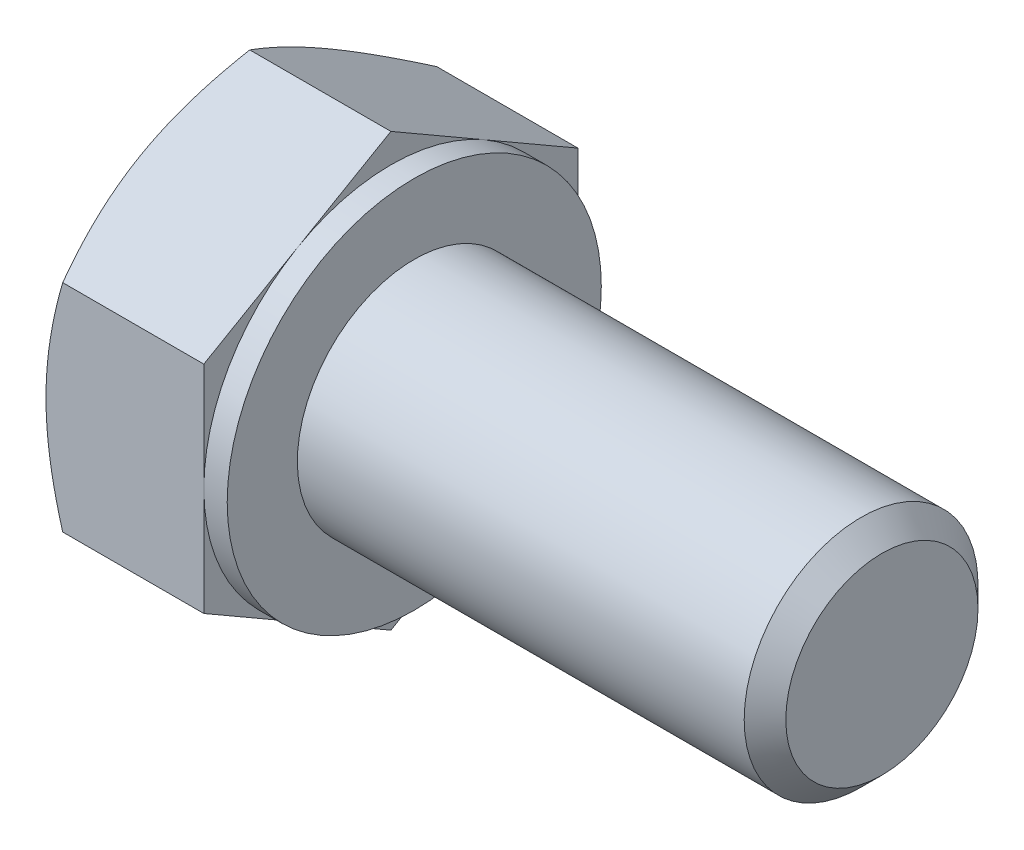
ISO-10303-21;
HEADER;
FILE_DESCRIPTION(('STEP AP214'),'2;1');
FILE_NAME('part.step','',(''),(''),'','','');
FILE_SCHEMA(('AUTOMOTIVE_DESIGN { 1 0 10303 214 1 1 1 1 }'));
ENDSEC;
DATA;
#1=APPLICATION_CONTEXT('core data for automotive mechanical design processes');
#2=APPLICATION_PROTOCOL_DEFINITION('international standard','automotive_design',2000,#1);
#3=PRODUCT_CONTEXT('',#1,'mechanical');
#4=PRODUCT('Part','Part','',(#3));
#5=PRODUCT_RELATED_PRODUCT_CATEGORY('part','',(#4));
#6=PRODUCT_DEFINITION_FORMATION('','',#4);
#7=PRODUCT_DEFINITION_CONTEXT('part definition',#1,'design');
#8=PRODUCT_DEFINITION('design','',#6,#7);
#9=PRODUCT_DEFINITION_SHAPE('','',#8);
#10=(LENGTH_UNIT() NAMED_UNIT(*) SI_UNIT(.MILLI.,.METRE.));
#11=(NAMED_UNIT(*) PLANE_ANGLE_UNIT() SI_UNIT($,.RADIAN.));
#12=(NAMED_UNIT(*) SI_UNIT($,.STERADIAN.) SOLID_ANGLE_UNIT());
#13=UNCERTAINTY_MEASURE_WITH_UNIT(LENGTH_MEASURE(1.E-05),#10,'distance_accuracy_value','');
#14=(GEOMETRIC_REPRESENTATION_CONTEXT(3) GLOBAL_UNCERTAINTY_ASSIGNED_CONTEXT((#13)) GLOBAL_UNIT_ASSIGNED_CONTEXT((#10,
#11,#12)) REPRESENTATION_CONTEXT('',''));
#15=CARTESIAN_POINT('',(0.,0.,0.));
#16=DIRECTION('',(0.,0.,1.));
#17=DIRECTION('',(1.,0.,0.));
#18=AXIS2_PLACEMENT_3D('',#15,#16,#17);
#19=CARTESIAN_POINT('',(0.,-4.048,4.048));
#20=DIRECTION('',(1.,0.,0.));
#21=DIRECTION('',(0.,0.,-1.));
#22=AXIS2_PLACEMENT_3D('',#19,#20,#21);
#23=PLANE('',#22);
#24=CARTESIAN_POINT('',(0.,0.,0.));
#25=DIRECTION('',(1.,0.,0.));
#26=DIRECTION('',(0.,0.,-1.));
#27=AXIS2_PLACEMENT_3D('',#24,#25,#26);
#28=CIRCLE('',#27,4.);
#29=CARTESIAN_POINT('',(0.,-4.48968754486885E-11,-4.));
#30=VERTEX_POINT('',#29);
#31=CARTESIAN_POINT('',(9.05612766631899E-11,-3.46410161545518,-2.00000000007762));
#32=VERTEX_POINT('',#31);
#33=EDGE_CURVE('E102',#30,#32,#28,.F.);
#34=ORIENTED_EDGE('',*,*,#33,.T.);
#35=CARTESIAN_POINT('',(0.,0.,0.));
#36=DIRECTION('',(1.,0.,0.));
#37=DIRECTION('',(0.,0.,-1.));
#38=AXIS2_PLACEMENT_3D('',#35,#36,#37);
#39=CIRCLE('',#38,4.);
#40=CARTESIAN_POINT('',(0.,-3.46410161544193,1.99999999978688));
#41=VERTEX_POINT('',#40);
#42=EDGE_CURVE('E20',#32,#41,#39,.F.);
#43=ORIENTED_EDGE('',*,*,#42,.T.);
#44=CARTESIAN_POINT('',(0.,0.,0.));
#45=DIRECTION('',(1.,0.,0.));
#46=DIRECTION('',(0.,0.,-1.));
#47=AXIS2_PLACEMENT_3D('',#44,#45,#46);
#48=CIRCLE('',#47,4.);
#49=CARTESIAN_POINT('',(0.,-8.20412825882905E-10,4.));
#50=VERTEX_POINT('',#49);
#51=EDGE_CURVE('E107',#41,#50,#48,.F.);
#52=ORIENTED_EDGE('',*,*,#51,.T.);
#53=CARTESIAN_POINT('',(0.,0.,0.));
#54=DIRECTION('',(1.,0.,0.));
#55=DIRECTION('',(0.,0.,-1.));
#56=AXIS2_PLACEMENT_3D('',#53,#54,#55);
#57=CIRCLE('',#56,4.);
#58=CARTESIAN_POINT('',(0.,3.46410161562151,1.99999999947582));
#59=VERTEX_POINT('',#58);
#60=EDGE_CURVE('E129',#50,#59,#57,.F.);
#61=ORIENTED_EDGE('',*,*,#60,.T.);
#62=CARTESIAN_POINT('',(0.,0.,0.));
#63=DIRECTION('',(1.,0.,0.));
#64=DIRECTION('',(0.,0.,-1.));
#65=AXIS2_PLACEMENT_3D('',#62,#63,#64);
#66=CIRCLE('',#65,4.);
#67=CARTESIAN_POINT('',(9.05615270489562E-11,3.46410161512313,-2.00000000033905));
#68=VERTEX_POINT('',#67);
#69=EDGE_CURVE('E131',#59,#68,#66,.F.);
#70=ORIENTED_EDGE('',*,*,#69,.T.);
#71=CARTESIAN_POINT('',(0.,0.,0.));
#72=DIRECTION('',(1.,0.,0.));
#73=DIRECTION('',(0.,0.,-1.));
#74=AXIS2_PLACEMENT_3D('',#71,#72,#73);
#75=CIRCLE('',#74,4.);
#76=EDGE_CURVE('E360',#68,#30,#75,.F.);
#77=ORIENTED_EDGE('',*,*,#76,.T.);
#78=EDGE_LOOP('',(#34,#43,#52,#61,#70,#77));
#79=FACE_BOUND('',#78,.T.);
#80=ADVANCED_FACE('F16',(#79),#23,.F.);
#81=CARTESIAN_POINT('',(0.,0.,0.));
#82=DIRECTION('',(1.,0.,0.));
#83=DIRECTION('',(0.,0.,-1.));
#84=AXIS2_PLACEMENT_3D('',#81,#82,#83);
#85=CONICAL_SURFACE('',#84,4.,1.04719755143113);
#86=ORIENTED_EDGE('',*,*,#42,.F.);
#87=CARTESIAN_POINT('',(1.81122678519263E-10,-3.46410161559149,-1.99999999984153));
#88=CARTESIAN_POINT('',(-1.63476620824464E-05,-3.51311217567406,-1.91511121967999));
#89=CARTESIAN_POINT('',(0.00207983256989033,-3.5621203747517,-1.83022652889895));
#90=CARTESIAN_POINT('',(0.0103757436094047,-3.66004054461236,-1.66062381963224));
#91=CARTESIAN_POINT('',(0.0165746620435072,-3.70895253252331,-1.57590577148014));
#92=CARTESIAN_POINT('',(0.0329137243178503,-3.80636434742651,-1.40718355882795));
#93=CARTESIAN_POINT('',(0.0430340271480449,-3.85486501280864,-1.32317794219399));
#94=CARTESIAN_POINT('',(0.0669981666289101,-3.9516352696251,-1.15556694074391));
#95=CARTESIAN_POINT('',(0.0808421012884008,-3.99990485494319,-1.07196156652144));
#96=CARTESIAN_POINT('',(0.127531677435721,-4.14416690936055,-0.822092358692448));
#97=CARTESIAN_POINT('',(0.165557762238871,-4.23974029178678,-0.656554404496317));
#98=CARTESIAN_POINT('',(0.253255639870936,-4.43006516752025,-0.326902049816178));
#99=CARTESIAN_POINT('',(0.302985593376994,-4.52481002212422,-0.162799147903546));
#100=CARTESIAN_POINT('',(0.357265589970877,-4.6188021539608,-6.79045580242806E-11));
#101=B_SPLINE_CURVE_WITH_KNOTS('',3,(#87,#88,#89,#90,#91,#92,#93,#94,#95,#96,#97,#98,#99,#100),
.UNSPECIFIED.,.F.,.F.,(4,2,2,2,2,2,4),(0.,0.294033350770126,0.588008498106595,0.880515245018404,
1.17302969168366,1.75729191084894,2.34452123750245),.UNSPECIFIED.);
#102=CARTESIAN_POINT('',(0.357265589967761,-4.6188021539554,0.));
#103=VERTEX_POINT('',#102);
#104=EDGE_CURVE('E115',#32,#103,#101,.T.);
#105=ORIENTED_EDGE('',*,*,#104,.T.);
#106=CARTESIAN_POINT('',(0.357265589930373,-4.61880215401437,9.88391246038269E-11));
#107=CARTESIAN_POINT('',(0.302985593368861,-4.52481002215302,0.162799147896884));
#108=CARTESIAN_POINT('',(0.253255639879103,-4.43006516754748,0.326902049780314));
#109=CARTESIAN_POINT('',(0.165557762263302,-4.23974029183033,0.656554404409638));
#110=CARTESIAN_POINT('',(0.127531677460239,-4.1441669094219,0.82209235858413));
#111=CARTESIAN_POINT('',(0.0808421013129403,-3.99990485502624,1.07196156637863));
#112=CARTESIAN_POINT('',(0.0669981666534271,-3.95163526971449,1.15556694058937));
#113=CARTESIAN_POINT('',(0.043034027171051,-3.85486501291115,1.32317794201615));
#114=CARTESIAN_POINT('',(0.03291372433937,-3.80636434753581,1.40718355863855));
#115=CARTESIAN_POINT('',(0.0165746620609383,-3.70895253264629,1.57590577126722));
#116=CARTESIAN_POINT('',(0.0103757436242123,-3.66004054474223,1.66062381940735));
#117=CARTESIAN_POINT('',(0.00207983257822892,-3.56212037489533,1.83022652865014));
#118=CARTESIAN_POINT('',(-1.6347657593429E-05,-3.51311217582457,1.91511121941923));
#119=CARTESIAN_POINT('',(1.81122553250089E-10,-3.46410161574888,1.99999999956892));
#120=B_SPLINE_CURVE_WITH_KNOTS('',3,(#106,#107,#108,#109,#110,#111,#112,#113,#114,#115,#116,
#117,#118,#119),.UNSPECIFIED.,.F.,.F.,(4,2,2,2,2,2,4),(0.,0.5872293265703,1.17149154565492,
1.46400599228054,1.75651273915288,2.05048788644854,2.34452123717758),.UNSPECIFIED.);
#121=EDGE_CURVE('E111',#103,#41,#120,.T.);
#122=ORIENTED_EDGE('',*,*,#121,.T.);
#123=EDGE_LOOP('',(#86,#105,#122));
#124=FACE_BOUND('',#123,.T.);
#125=ADVANCED_FACE('F114',(#124),#85,.T.);
#126=CARTESIAN_POINT('',(13.875,-2.07966,-2.07966));
#127=DIRECTION('',(-1.,0.,0.));
#128=DIRECTION('',(0.,0.,1.));
#129=AXIS2_PLACEMENT_3D('',#126,#127,#128);
#130=PLANE('',#129);
#131=CARTESIAN_POINT('',(13.8750000000001,0.,0.));
#132=DIRECTION('',(-1.,0.,0.));
#133=DIRECTION('',(0.,0.,1.));
#134=AXIS2_PLACEMENT_3D('',#131,#132,#133);
#135=CIRCLE('',#134,2.05499999999992);
#136=CARTESIAN_POINT('',(13.8750000000001,0.,2.05499999999992));
#137=VERTEX_POINT('',#136);
#138=EDGE_CURVE('E167',#137,#137,#135,.F.);
#139=ORIENTED_EDGE('',*,*,#138,.T.);
#140=EDGE_LOOP('',(#139));
#141=FACE_BOUND('',#140,.T.);
#142=ADVANCED_FACE('F408',(#141),#130,.F.);
#143=CARTESIAN_POINT('',(-0.02025,-4.618802154,0.));
#144=DIRECTION('',(0.,0.866025403761798,-0.500000000039214));
#145=DIRECTION('',(0.,0.500000000039214,0.866025403761798));
#146=AXIS2_PLACEMENT_3D('',#143,#144,#145);
#147=PLANE('',#146);
#148=DIRECTION('',(-1.,0.,0.));
#149=VECTOR('',#148,1.);
#150=CARTESIAN_POINT('',(1.677375,-2.309401077,4.));
#151=LINE('',#150,#149);
#152=CARTESIAN_POINT('',(3.375,-2.3094010767412,4.));
#153=VERTEX_POINT('',#152);
#154=CARTESIAN_POINT('',(0.35726558979231,-2.30940107698625,4.00000000002382));
#155=VERTEX_POINT('',#154);
#156=EDGE_CURVE('E122',#153,#155,#151,.T.);
#157=ORIENTED_EDGE('',*,*,#156,.T.);
#158=CARTESIAN_POINT('',(0.357265589854448,-2.30940107690265,3.99999999998925));
#159=CARTESIAN_POINT('',(0.302985593215995,-2.40339320881863,3.83720085213279));
#160=CARTESIAN_POINT('',(0.253255639691258,-2.49813806347495,3.67309795017575));
#161=CARTESIAN_POINT('',(0.165557762051708,-2.68846293928937,3.34344559538809));
#162=CARTESIAN_POINT('',(0.127531677259506,-2.78403632174429,3.17790764112896));
#163=CARTESIAN_POINT('',(0.0808421011338921,-2.92829837621076,2.92803843321041));
#164=CARTESIAN_POINT('',(0.0669981664825396,-2.97656796154617,2.84443305895903));
#165=CARTESIAN_POINT('',(0.0430340270217538,-3.07333821839663,2.67682205745088));
#166=CARTESIAN_POINT('',(0.0329137242034976,-3.12183888379543,2.59281644078775));
#167=CARTESIAN_POINT('',(0.0165746619562686,-3.21925069873244,2.42409422807678));
#168=CARTESIAN_POINT('',(0.0103757435373933,-3.26816268666052,2.33937617989506));
#169=CARTESIAN_POINT('',(0.00207983253152242,-3.3660828565552,2.16977347056955));
#170=CARTESIAN_POINT('',(-1.6347682028425E-05,-3.41509105564972,2.08488877975932));
#171=CARTESIAN_POINT('',(1.81123054124567E-10,-3.46410161574888,1.99999999956892));
#172=B_SPLINE_CURVE_WITH_KNOTS('',3,(#158,#159,#160,#161,#162,#163,#164,#165,#166,#167,#168,
#169,#170,#171),.UNSPECIFIED.,.F.,.F.,(4,2,2,2,2,2,4),(0.,0.587229326854448,1.17149154621468,
1.46400599297653,1.75651273998472,2.05048788742066,2.34452123829062),.UNSPECIFIED.);
#173=EDGE_CURVE('E118',#155,#41,#172,.T.);
#174=ORIENTED_EDGE('',*,*,#173,.T.);
#175=ORIENTED_EDGE('',*,*,#121,.F.);
#176=DIRECTION('',(1.,0.,0.));
#177=VECTOR('',#176,1.);
#178=CARTESIAN_POINT('',(1.677375,-4.618802154,0.));
#179=LINE('',#178,#177);
#180=CARTESIAN_POINT('',(3.375,-4.61880215364415,-5.60311345931819E-11));
#181=VERTEX_POINT('',#180);
#182=EDGE_CURVE('E220',#103,#181,#179,.T.);
#183=ORIENTED_EDGE('',*,*,#182,.T.);
#184=DIRECTION('',(0.,-0.500000000051408,-0.866025403754758));
#185=VECTOR('',#184,1.);
#186=CARTESIAN_POINT('',(3.375,-3.46410161551759,1.999999999008));
#187=LINE('',#186,#185);
#188=CARTESIAN_POINT('',(3.375,-3.46410161519598,1.99999999956505));
#189=VERTEX_POINT('',#188);
#190=EDGE_CURVE('E321',#189,#181,#187,.T.);
#191=ORIENTED_EDGE('',*,*,#190,.F.);
#192=DIRECTION('',(0.,-0.499999999974159,-0.866025403799358));
#193=VECTOR('',#192,1.);
#194=CARTESIAN_POINT('',(3.375,-2.30940107648241,4.));
#195=LINE('',#194,#193);
#196=EDGE_CURVE('E316',#153,#189,#195,.T.);
#197=ORIENTED_EDGE('',*,*,#196,.F.);
#198=EDGE_LOOP('',(#157,#174,#175,#183,#191,#197));
#199=FACE_BOUND('',#198,.T.);
#200=ADVANCED_FACE('F120',(#199),#147,.F.);
#201=CARTESIAN_POINT('',(0.,0.,0.));
#202=DIRECTION('',(1.,0.,0.));
#203=DIRECTION('',(0.,0.,-1.));
#204=AXIS2_PLACEMENT_3D('',#201,#202,#203);
#205=CONICAL_SURFACE('',#204,4.,1.04719755143113);
#206=ORIENTED_EDGE('',*,*,#51,.F.);
#207=ORIENTED_EDGE('',*,*,#173,.F.);
#208=CARTESIAN_POINT('',(0.357265589689808,-2.3094010767135,4.00000000001811));
#209=CARTESIAN_POINT('',(0.302985593112752,-2.12141681307386,4.00000000000633));
#210=CARTESIAN_POINT('',(0.253255639618964,-1.93192710390089,4.00000000000165));
#211=CARTESIAN_POINT('',(0.165557762006757,-1.5512773525052,3.99999999999836));
#212=CARTESIAN_POINT('',(0.127531677211222,-1.36013058768904,3.9999999999997));
#213=CARTESIAN_POINT('',(0.0808421010752319,-1.07160647890902,4.00000000000015));
#214=CARTESIAN_POINT('',(0.0669981664195016,-0.975067308291083,4.00000000000004));
#215=CARTESIAN_POINT('',(0.0430340269456507,-0.781526794694822,3.99999999999996));
#216=CARTESIAN_POINT('',(0.0329137241187107,-0.684525463948985,3.99999999999999));
#217=CARTESIAN_POINT('',(0.0165746618504254,-0.489701834179733,4.00000000000001));
#218=CARTESIAN_POINT('',(0.0103757434191214,-0.391877858376556,4.00000000000001));
#219=CARTESIAN_POINT('',(0.00207983238463717,-0.196037518692821,3.99999999999999));
#220=CARTESIAN_POINT('',(-1.63478451053877E-05,-0.098021120556421,3.99999999999999));
#221=CARTESIAN_POINT('',(0.,-4.10206424513662E-10,4.));
#222=B_SPLINE_CURVE_WITH_KNOTS('',3,(#208,#209,#210,#211,#212,#213,#214,#215,#216,#217,#218,
#219,#220,#221),.UNSPECIFIED.,.F.,.F.,(4,2,2,2,2,2,4),(0.,0.587229326585918,1.17149154568423,
1.46400599231617,1.75651273919471,2.05048788649759,2.34452123723402),.UNSPECIFIED.);
#223=EDGE_CURVE('E127',#155,#50,#222,.T.);
#224=ORIENTED_EDGE('',*,*,#223,.T.);
#225=EDGE_LOOP('',(#206,#207,#224));
#226=FACE_BOUND('',#225,.T.);
#227=ADVANCED_FACE('F126',(#226),#205,.T.);
#228=CARTESIAN_POINT('',(0.,0.,0.));
#229=DIRECTION('',(1.,0.,0.));
#230=DIRECTION('',(0.,0.,-1.));
#231=AXIS2_PLACEMENT_3D('',#228,#229,#230);
#232=CONICAL_SURFACE('',#231,4.,1.04719755143113);
#233=CARTESIAN_POINT('',(0.357265589760677,2.30940107703482,3.99999999998613));
#234=CARTESIAN_POINT('',(0.302985593168477,2.40339320889299,3.83720085208287));
#235=CARTESIAN_POINT('',(0.253255639663168,2.49813806352639,3.67309795010727));
#236=CARTESIAN_POINT('',(0.165557762039684,2.68846293932492,3.343445595306));
#237=CARTESIAN_POINT('',(0.127531677244271,2.78403632178672,3.1779076410517));
#238=CARTESIAN_POINT('',(0.0808421011199772,2.92829837625608,2.92803843313379));
#239=CARTESIAN_POINT('',(0.0669981664700662,2.97656796159135,2.84443305888129));
#240=CARTESIAN_POINT('',(0.0430340270117462,3.07333821844223,2.67682205737139));
#241=CARTESIAN_POINT('',(0.0329137241945181,3.12183888384161,2.59281644070763));
#242=CARTESIAN_POINT('',(0.0165746619496308,3.21925069877939,2.4240942279956));
#243=CARTESIAN_POINT('',(0.0103757435320555,3.26816268670767,2.33937617981346));
#244=CARTESIAN_POINT('',(0.00207983252885353,3.36608285660265,2.16977347048729));
#245=CARTESIAN_POINT('',(-1.63476833350326E-05,3.41509105569726,2.08488877967682));
#246=CARTESIAN_POINT('',(1.81122553358746E-10,3.46410161579659,1.99999999948628));
#247=B_SPLINE_CURVE_WITH_KNOTS('',3,(#233,#234,#235,#236,#237,#238,#239,#240,#241,#242,#243,
#244,#245,#246),.UNSPECIFIED.,.F.,.F.,(4,2,2,2,2,2,4),(0.,0.587229326853131,1.17149154621395,
1.46400599297771,1.75651273998812,2.05048788742518,2.3445212382958),.UNSPECIFIED.);
#248=CARTESIAN_POINT('',(0.357265589779538,2.30940107698326,4.));
#249=VERTEX_POINT('',#248);
#250=EDGE_CURVE('E194',#249,#59,#247,.T.);
#251=ORIENTED_EDGE('',*,*,#250,.T.);
#252=ORIENTED_EDGE('',*,*,#60,.F.);
#253=CARTESIAN_POINT('',(0.,-4.10206290494882E-10,4.));
#254=CARTESIAN_POINT('',(-1.63478567543018E-05,0.0980211197819579,4.));
#255=CARTESIAN_POINT('',(0.00207983236336867,0.196037517964554,4.));
#256=CARTESIAN_POINT('',(0.0103757433826737,0.391877857740859,4.));
#257=CARTESIAN_POINT('',(0.0165746618084155,0.489701833590411,4.));
#258=CARTESIAN_POINT('',(0.0329137240696036,0.684525463451578,4.));
#259=CARTESIAN_POINT('',(0.0430340268949655,0.781526794242959,4.));
#260=CARTESIAN_POINT('',(0.066998166369531,0.975067307930032,4.));
#261=CARTESIAN_POINT('',(0.0808421010275546,1.07160647859324,4.));
#262=CARTESIAN_POINT('',(0.127531677175138,1.36013058750826,4.));
#263=CARTESIAN_POINT('',(0.16555776198469,1.55127735241361,4.));
#264=CARTESIAN_POINT('',(0.253255639639514,1.93192710398588,4.));
#265=CARTESIAN_POINT('',(0.302985593162038,2.12141681324623,4.));
#266=CARTESIAN_POINT('',(0.357265589775876,2.30940107697058,4.));
#267=B_SPLINE_CURVE_WITH_KNOTS('',3,(#253,#254,#255,#256,#257,#258,#259,#260,#261,#262,#263,
#264,#265,#266),.UNSPECIFIED.,.F.,.F.,(4,2,2,2,2,2,4),(0.,0.294033350874247,0.588008498314782,
0.880515245328601,1.17302969209586,1.75729191146405,2.34452123832463),.UNSPECIFIED.);
#268=EDGE_CURVE('E162',#50,#249,#267,.T.);
#269=ORIENTED_EDGE('',*,*,#268,.T.);
#270=EDGE_LOOP('',(#251,#252,#269));
#271=FACE_BOUND('',#270,.T.);
#272=ADVANCED_FACE('F149',(#271),#232,.T.);
#273=CARTESIAN_POINT('',(0.,0.,0.));
#274=DIRECTION('',(1.,0.,0.));
#275=DIRECTION('',(0.,0.,-1.));
#276=AXIS2_PLACEMENT_3D('',#273,#274,#275);
#277=CONICAL_SURFACE('',#276,4.,1.04719755143113);
#278=CARTESIAN_POINT('',(0.357265589930373,4.61880215401437,-9.88389482289751E-11));
#279=CARTESIAN_POINT('',(0.302985593357354,4.52481002213314,-0.162799147931308));
#280=CARTESIAN_POINT('',(0.253255639858031,4.43006516750737,-0.326902049849788));
#281=CARTESIAN_POINT('',(0.165557762228657,4.23974029174958,-0.656554404549516));
#282=CARTESIAN_POINT('',(0.127531677421527,4.14416690932073,-0.822092358759353));
#283=CARTESIAN_POINT('',(0.0808421012731886,3.99990485489417,-1.07196156660739));
#284=CARTESIAN_POINT('',(0.0669981666141712,3.95163526957204,-1.1555669408361));
#285=CARTESIAN_POINT('',(0.0430340271346043,3.85486501274791,-1.3231779422989));
#286=CARTESIAN_POINT('',(0.0329137243052367,3.80636434736216,-1.40718355893933));
#287=CARTESIAN_POINT('',(0.0165746620333121,3.70895253245165,-1.57590577160435));
#288=CARTESIAN_POINT('',(0.0103757436007998,3.66004054453701,-1.66062381976279));
#289=CARTESIAN_POINT('',(0.00207983256512378,3.56212037466905,-1.83022652904207));
#290=CARTESIAN_POINT('',(-1.63476646042455E-05,3.5131121755878,-1.91511121982933));
#291=CARTESIAN_POINT('',(1.8112305405121E-10,3.4641016155017,-1.99999999999706));
#292=B_SPLINE_CURVE_WITH_KNOTS('',3,(#278,#279,#280,#281,#282,#283,#284,#285,#286,#287,#288,
#289,#290,#291),.UNSPECIFIED.,.F.,.F.,(4,2,2,2,2,2,4),(0.,0.587229326694654,1.17149154590143,
1.46400599258843,1.75651273952213,2.05048788688024,2.34452123767177),.UNSPECIFIED.);
#293=CARTESIAN_POINT('',(0.357265589980637,4.6188021539777,3.86262036719799E-11));
#294=VERTEX_POINT('',#293);
#295=EDGE_CURVE('E365',#294,#68,#292,.T.);
#296=ORIENTED_EDGE('',*,*,#295,.T.);
#297=ORIENTED_EDGE('',*,*,#69,.F.);
#298=CARTESIAN_POINT('',(1.8112255332638E-10,3.46410161579659,1.99999999948628));
#299=CARTESIAN_POINT('',(-1.63476562648761E-05,3.51311217587052,1.91511121933971));
#300=CARTESIAN_POINT('',(0.00207983258076447,3.56212037493946,1.83022652857374));
#301=CARTESIAN_POINT('',(0.010375743628831,3.66004054478264,1.66062381933731));
#302=CARTESIAN_POINT('',(0.0165746620664297,3.70895253268482,1.5759057712004));
#303=CARTESIAN_POINT('',(0.0329137243461721,3.8063643475706,1.40718355857838));
#304=CARTESIAN_POINT('',(0.0430340271782866,3.85486501294409,1.32317794195938));
#305=CARTESIAN_POINT('',(0.0669981666614829,3.9516352697433,1.15556694053919));
#306=CARTESIAN_POINT('',(0.080842101321385,3.99990485505278,1.07196156633163));
#307=CARTESIAN_POINT('',(0.127531677467842,4.14416690944449,0.822092358547056));
#308=CARTESIAN_POINT('',(0.165557762267617,4.23974029185379,0.656554404380253));
#309=CARTESIAN_POINT('',(0.253255639888419,4.43006516755353,0.326902049758533));
#310=CARTESIAN_POINT('',(0.302985593386542,4.52481002214071,0.162799147874983));
#311=CARTESIAN_POINT('',(0.357265589970877,4.6188021539608,6.79049630652923E-11));
#312=B_SPLINE_CURVE_WITH_KNOTS('',3,(#298,#299,#300,#301,#302,#303,#304,#305,#306,#307,#308,
#309,#310,#311),.UNSPECIFIED.,.F.,.F.,(4,2,2,2,2,2,4),(0.,0.294033350718284,0.588008498002932,
0.88051524486382,1.17302969147815,1.75729191054207,2.3445212370924),.UNSPECIFIED.);
#313=EDGE_CURVE('E189',#59,#294,#312,.T.);
#314=ORIENTED_EDGE('',*,*,#313,.T.);
#315=EDGE_LOOP('',(#296,#297,#314));
#316=FACE_BOUND('',#315,.T.);
#317=ADVANCED_FACE('F366',(#316),#277,.T.);
#318=CARTESIAN_POINT('',(0.,0.,0.));
#319=DIRECTION('',(1.,0.,0.));
#320=DIRECTION('',(0.,0.,-1.));
#321=AXIS2_PLACEMENT_3D('',#318,#319,#320);
#322=CONICAL_SURFACE('',#321,4.,1.04719755143113);
#323=CARTESIAN_POINT('',(0.357265589760677,2.30940107697058,-4.00000000002322));
#324=CARTESIAN_POINT('',(0.302985593163694,2.12141681327006,-4.00000000000811));
#325=CARTESIAN_POINT('',(0.2532556396512,1.93192710403547,-4.00000000000212));
#326=CARTESIAN_POINT('',(0.165557762008034,1.55127735251604,-3.99999999999789));
#327=CARTESIAN_POINT('',(0.127531677200179,1.36013058763776,-3.99999999999961));
#328=CARTESIAN_POINT('',(0.080842101053029,1.07160647876331,-4.00000000000019));
#329=CARTESIAN_POINT('',(0.0669981663947939,0.975067308113603,-4.00000000000005));
#330=CARTESIAN_POINT('',(0.043034026918512,0.781526794453578,-3.99999999999995));
#331=CARTESIAN_POINT('',(0.0329137240916459,0.68452546367575,-3.99999999999999));
#332=CARTESIAN_POINT('',(0.0165746618262608,0.489701833841969,-4.00000000000002));
#333=CARTESIAN_POINT('',(0.0103757433978101,0.391877858006252,-4.00000000000001));
#334=CARTESIAN_POINT('',(0.00207983237185978,0.196037518257541,-3.99999999999999));
#335=CARTESIAN_POINT('',(-1.63478522013871E-05,0.0980211200887051,-3.99999999999999));
#336=CARTESIAN_POINT('',(0.,-8.97936707313728E-11,-4.));
#337=B_SPLINE_CURVE_WITH_KNOTS('',3,(#323,#324,#325,#326,#327,#328,#329,#330,#331,#332,#333,
#334,#335,#336),.UNSPECIFIED.,.F.,.F.,(4,2,2,2,2,2,4),(0.,0.587229326778468,1.1714915460664,
1.46400599279368,1.75651273976757,2.05048788716724,2.34452123800051),.UNSPECIFIED.);
#338=CARTESIAN_POINT('',(0.357265589779538,2.30940107700837,-3.9999999999855));
#339=VERTEX_POINT('',#338);
#340=EDGE_CURVE('E259',#339,#30,#337,.T.);
#341=ORIENTED_EDGE('',*,*,#340,.T.);
#342=ORIENTED_EDGE('',*,*,#76,.F.);
#343=CARTESIAN_POINT('',(1.81123054097912E-10,3.4641016155017,-1.99999999999706));
#344=CARTESIAN_POINT('',(-1.63476749801808E-05,3.41509105541472,-2.08488878016623));
#345=CARTESIAN_POINT('',(0.00207983254449029,3.36608285633254,-2.16977347095515));
#346=CARTESIAN_POINT('',(0.0103757435600243,3.26816268646253,-2.33937618023804));
#347=CARTESIAN_POINT('',(0.0165746619826492,3.21925069854679,-2.42409422839844));
#348=CARTESIAN_POINT('',(0.03291372423532,3.12183888363398,-2.59281644106727));
#349=CARTESIAN_POINT('',(0.0430340270553028,3.07333821824704,-2.67682205770958));
#350=CARTESIAN_POINT('',(0.0669981665170784,2.97656796142082,-2.84443305917655));
#351=CARTESIAN_POINT('',(0.0808421011676911,2.92829837609779,-2.92803843340758));
#352=CARTESIAN_POINT('',(0.127531677290504,2.78403632166555,-3.17790764126236));
#353=CARTESIAN_POINT('',(0.165557762080126,2.68846293922927,-3.34344559547588));
#354=CARTESIAN_POINT('',(0.253255639690276,2.49813806347551,-3.67309795019117));
#355=CARTESIAN_POINT('',(0.302985593188006,2.40339320886129,-3.83720085212155));
#356=CARTESIAN_POINT('',(0.357265589775876,2.30940107701471,-3.99999999997452));
#357=B_SPLINE_CURVE_WITH_KNOTS('',3,(#343,#344,#345,#346,#347,#348,#349,#350,#351,#352,#353,
#354,#355,#356),.UNSPECIFIED.,.F.,.F.,(4,2,2,2,2,2,4),(0.,0.29403335079657,0.588008498159517,
0.880515245096855,1.17302969178762,1.75729191100377,2.34452123771006),.UNSPECIFIED.);
#358=EDGE_CURVE('E369',#68,#339,#357,.T.);
#359=ORIENTED_EDGE('',*,*,#358,.T.);
#360=EDGE_LOOP('',(#341,#342,#359));
#361=FACE_BOUND('',#360,.T.);
#362=ADVANCED_FACE('F371',(#361),#322,.T.);
#363=CARTESIAN_POINT('',(0.,0.,0.));
#364=DIRECTION('',(1.,0.,0.));
#365=DIRECTION('',(0.,0.,-1.));
#366=AXIS2_PLACEMENT_3D('',#363,#364,#365);
#367=CONICAL_SURFACE('',#366,4.,1.04719755143113);
#368=ORIENTED_EDGE('',*,*,#33,.F.);
#369=CARTESIAN_POINT('',(0.,-8.97937508973771E-11,-4.));
#370=CARTESIAN_POINT('',(-1.63478496639468E-05,-0.0980211202608911,-4.));
#371=CARTESIAN_POINT('',(0.00207983237662251,-0.196037518422266,-4.));
#372=CARTESIAN_POINT('',(0.0103757434063523,-0.391877858155963,-4.));
#373=CARTESIAN_POINT('',(0.0165746618363561,-0.489701833984127,-4.));
#374=CARTESIAN_POINT('',(0.0329137241041256,-0.684525463802842,-4.));
#375=CARTESIAN_POINT('',(0.0430340269318272,-0.781526794573158,-4.));
#376=CARTESIAN_POINT('',(0.0669981664092339,-0.975067308218176,-4.));
#377=CARTESIAN_POINT('',(0.0808421010677592,-1.07160647886039,-4.));
#378=CARTESIAN_POINT('',(0.127531677214291,-1.36013058771289,-4.));
#379=CARTESIAN_POINT('',(0.165557762019729,-1.55127735257696,-4.));
#380=CARTESIAN_POINT('',(0.253255639660824,-1.93192710406702,-4.));
#381=CARTESIAN_POINT('',(0.302985593173675,-2.12141681328643,-4.));
#382=CARTESIAN_POINT('',(0.357265589775876,-2.30940107697058,-4.));
#383=B_SPLINE_CURVE_WITH_KNOTS('',3,(#369,#370,#371,#372,#373,#374,#375,#376,#377,#378,#379,
#380,#381,#382),.UNSPECIFIED.,.F.,.F.,(4,2,2,2,2,2,4),(0.,0.294033350811056,0.588008498188427,
0.880515245140178,1.17302969184537,1.75729191109001,2.34452123782481),.UNSPECIFIED.);
#384=CARTESIAN_POINT('',(0.357265589774707,-2.30940107699163,-3.9999999999855));
#385=VERTEX_POINT('',#384);
#386=EDGE_CURVE('E252',#30,#385,#383,.T.);
#387=ORIENTED_EDGE('',*,*,#386,.T.);
#388=CARTESIAN_POINT('',(0.357265589760677,-2.30940107703482,-3.99999999998613));
#389=CARTESIAN_POINT('',(0.302985593178024,-2.4033932088765,-3.83720085211143));
#390=CARTESIAN_POINT('',(0.253255639680651,-2.49813806349311,-3.67309795016491));
#391=CARTESIAN_POINT('',(0.16555776206843,-2.68846293925791,-3.34344559542206));
#392=CARTESIAN_POINT('',(0.127531677276393,-2.78403632170278,-3.1779076411971));
#393=CARTESIAN_POINT('',(0.0808421011529611,-2.92829837614649,-2.9280384333236));
#394=CARTESIAN_POINT('',(0.0669981665026384,-2.97656796147315,-2.84443305908602));
#395=CARTESIAN_POINT('',(0.0430340270419877,-3.07333821830678,-2.67682205760599));
#396=CARTESIAN_POINT('',(0.0329137242228405,-3.12183888369752,-2.5928164409572));
#397=CARTESIAN_POINT('',(0.0165746619725541,-3.21925069861788,-2.42409422827533));
#398=CARTESIAN_POINT('',(0.0103757435514821,-3.26816268653739,-2.33937618010839));
#399=CARTESIAN_POINT('',(0.00207983253972719,-3.36608285641489,-2.16977347081249));
#400=CARTESIAN_POINT('',(-1.6347677518144E-05,-3.4150910555008,-2.0848887800171));
#401=CARTESIAN_POINT('',(1.81122553334194E-10,-3.46410161559149,-1.99999999984153));
#402=B_SPLINE_CURVE_WITH_KNOTS('',3,(#388,#389,#390,#391,#392,#393,#394,#395,#396,#397,#398,
#399,#400,#401),.UNSPECIFIED.,.F.,.F.,(4,2,2,2,2,2,4),(0.,0.587229326749948,1.1714915460094,
1.46400599272224,1.75651273968173,2.05048788706697,2.34452123788575),.UNSPECIFIED.);
#403=EDGE_CURVE('E332',#385,#32,#402,.T.);
#404=ORIENTED_EDGE('',*,*,#403,.T.);
#405=EDGE_LOOP('',(#368,#387,#404));
#406=FACE_BOUND('',#405,.T.);
#407=ADVANCED_FACE('F265',(#406),#367,.T.);
#408=CARTESIAN_POINT('',(-0.02025,-2.309401077,-4.));
#409=DIRECTION('',(0.,0.866025403761798,0.500000000039214));
#410=DIRECTION('',(0.,-0.500000000039214,0.866025403761798));
#411=AXIS2_PLACEMENT_3D('',#408,#409,#410);
#412=PLANE('',#411);
#413=ORIENTED_EDGE('',*,*,#182,.F.);
#414=ORIENTED_EDGE('',*,*,#104,.F.);
#415=ORIENTED_EDGE('',*,*,#403,.F.);
#416=DIRECTION('',(1.,0.,0.));
#417=VECTOR('',#416,1.);
#418=CARTESIAN_POINT('',(1.677375,-2.309401077,-4.));
#419=LINE('',#418,#417);
#420=CARTESIAN_POINT('',(3.375,-2.3094010767412,-4.));
#421=VERTEX_POINT('',#420);
#422=EDGE_CURVE('E258',#385,#421,#419,.T.);
#423=ORIENTED_EDGE('',*,*,#422,.T.);
#424=DIRECTION('',(0.,0.499999999974159,-0.866025403799358));
#425=VECTOR('',#424,1.);
#426=CARTESIAN_POINT('',(3.375,-3.46410161444723,-2.00000000058));
#427=LINE('',#426,#425);
#428=CARTESIAN_POINT('',(3.375,-3.4641016150061,-1.99999999992002));
#429=VERTEX_POINT('',#428);
#430=EDGE_CURVE('E221',#429,#421,#427,.T.);
#431=ORIENTED_EDGE('',*,*,#430,.F.);
#432=DIRECTION('',(0.,0.500000000051408,-0.866025403754758));
#433=VECTOR('',#432,1.);
#434=CARTESIAN_POINT('',(3.375,-4.61880215348241,0.));
#435=LINE('',#434,#433);
#436=EDGE_CURVE('E318',#181,#429,#435,.T.);
#437=ORIENTED_EDGE('',*,*,#436,.F.);
#438=EDGE_LOOP('',(#413,#414,#415,#423,#431,#437));
#439=FACE_BOUND('',#438,.T.);
#440=ADVANCED_FACE('F337',(#439),#412,.F.);
#441=CARTESIAN_POINT('',(3.375,-3.484886225,-1.988));
#442=DIRECTION('',(1.,0.,0.));
#443=DIRECTION('',(0.,0.,-1.));
#444=AXIS2_PLACEMENT_3D('',#441,#442,#443);
#445=PLANE('',#444);
#446=DIRECTION('',(0.,1.,0.));
#447=VECTOR('',#446,1.);
#448=CARTESIAN_POINT('',(3.375,0.,-4.));
#449=LINE('',#448,#447);
#450=CARTESIAN_POINT('',(3.375,-8.20413718998489E-10,-4.));
#451=VERTEX_POINT('',#450);
#452=EDGE_CURVE('E251',#421,#451,#449,.T.);
#453=ORIENTED_EDGE('',*,*,#452,.T.);
#454=CARTESIAN_POINT('',(3.375,0.,0.));
#455=DIRECTION('',(-1.,0.,0.));
#456=DIRECTION('',(0.,-1.,0.));
#457=AXIS2_PLACEMENT_3D('',#454,#455,#456);
#458=CIRCLE('',#457,4.);
#459=EDGE_CURVE('E248',#451,#429,#458,.T.);
#460=ORIENTED_EDGE('',*,*,#459,.T.);
#461=ORIENTED_EDGE('',*,*,#430,.T.);
#462=EDGE_LOOP('',(#453,#460,#461));
#463=FACE_BOUND('',#462,.T.);
#464=ADVANCED_FACE('F341',(#463),#445,.T.);
#465=CARTESIAN_POINT('',(3.375,-4.625730357,2.024));
#466=DIRECTION('',(1.,0.,0.));
#467=DIRECTION('',(0.,0.,-1.));
#468=AXIS2_PLACEMENT_3D('',#465,#466,#467);
#469=PLANE('',#468);
#470=ORIENTED_EDGE('',*,*,#436,.T.);
#471=CARTESIAN_POINT('',(3.375,0.,0.));
#472=DIRECTION('',(-1.,0.,0.));
#473=DIRECTION('',(0.,-1.,0.));
#474=AXIS2_PLACEMENT_3D('',#471,#472,#473);
#475=CIRCLE('',#474,4.);
#476=EDGE_CURVE('E245',#429,#189,#475,.T.);
#477=ORIENTED_EDGE('',*,*,#476,.T.);
#478=ORIENTED_EDGE('',*,*,#190,.T.);
#479=EDGE_LOOP('',(#470,#477,#478));
#480=FACE_BOUND('',#479,.T.);
#481=ADVANCED_FACE('F306',(#480),#469,.T.);
#482=CARTESIAN_POINT('',(3.375,-3.484886225,4.));
#483=DIRECTION('',(1.,0.,0.));
#484=DIRECTION('',(0.,0.,-1.));
#485=AXIS2_PLACEMENT_3D('',#482,#483,#484);
#486=PLANE('',#485);
#487=ORIENTED_EDGE('',*,*,#196,.T.);
#488=CARTESIAN_POINT('',(3.375,0.,0.));
#489=DIRECTION('',(-1.,0.,0.));
#490=DIRECTION('',(0.,-1.,0.));
#491=AXIS2_PLACEMENT_3D('',#488,#489,#490);
#492=CIRCLE('',#491,4.);
#493=CARTESIAN_POINT('',(3.375,-8.27880598994781E-11,4.));
#494=VERTEX_POINT('',#493);
#495=EDGE_CURVE('E219',#189,#494,#492,.T.);
#496=ORIENTED_EDGE('',*,*,#495,.T.);
#497=DIRECTION('',(0.,-1.,0.));
#498=VECTOR('',#497,1.);
#499=CARTESIAN_POINT('',(3.375,0.,4.));
#500=LINE('',#499,#498);
#501=EDGE_CURVE('E212',#494,#153,#500,.T.);
#502=ORIENTED_EDGE('',*,*,#501,.T.);
#503=EDGE_LOOP('',(#487,#496,#502));
#504=FACE_BOUND('',#503,.T.);
#505=ADVANCED_FACE('F177',(#504),#486,.T.);
#506=CARTESIAN_POINT('',(13.875,0.,0.));
#507=DIRECTION('',(-1.,0.,0.));
#508=DIRECTION('',(0.,0.,1.));
#509=AXIS2_PLACEMENT_3D('',#506,#507,#508);
#510=CONICAL_SURFACE('',#509,2.055,0.785398163397445);
#511=ORIENTED_EDGE('',*,*,#138,.F.);
#512=EDGE_LOOP('',(#511));
#513=FACE_BOUND('',#512,.T.);
#514=CARTESIAN_POINT('',(13.43,0.,0.));
#515=DIRECTION('',(-1.,0.,0.));
#516=DIRECTION('',(0.,0.,1.));
#517=AXIS2_PLACEMENT_3D('',#514,#515,#516);
#518=CIRCLE('',#517,2.5);
#519=CARTESIAN_POINT('',(13.43,0.,2.5));
#520=VERTEX_POINT('',#519);
#521=EDGE_CURVE('E215',#520,#520,#518,.F.);
#522=ORIENTED_EDGE('',*,*,#521,.T.);
#523=EDGE_LOOP('',(#522));
#524=FACE_BOUND('',#523,.T.);
#525=ADVANCED_FACE('F175',(#513,#524),#510,.T.);
#526=CARTESIAN_POINT('',(-0.02025,-2.309401077,4.));
#527=DIRECTION('',(0.,0.,-1.));
#528=DIRECTION('',(0.,1.,0.));
#529=AXIS2_PLACEMENT_3D('',#526,#527,#528);
#530=PLANE('',#529);
#531=DIRECTION('',(-1.,0.,0.));
#532=VECTOR('',#531,1.);
#533=CARTESIAN_POINT('',(1.677375,2.309401077,4.));
#534=LINE('',#533,#532);
#535=CARTESIAN_POINT('',(3.375,2.30940107674121,4.));
#536=VERTEX_POINT('',#535);
#537=EDGE_CURVE('E199',#536,#249,#534,.T.);
#538=ORIENTED_EDGE('',*,*,#537,.T.);
#539=ORIENTED_EDGE('',*,*,#268,.F.);
#540=ORIENTED_EDGE('',*,*,#223,.F.);
#541=ORIENTED_EDGE('',*,*,#156,.F.);
#542=ORIENTED_EDGE('',*,*,#501,.F.);
#543=DIRECTION('',(0.,-1.,0.));
#544=VECTOR('',#543,1.);
#545=CARTESIAN_POINT('',(3.375,1.7320508075,4.));
#546=LINE('',#545,#544);
#547=EDGE_CURVE('E241',#536,#494,#546,.T.);
#548=ORIENTED_EDGE('',*,*,#547,.F.);
#549=EDGE_LOOP('',(#538,#539,#540,#541,#542,#548));
#550=FACE_BOUND('',#549,.T.);
#551=ADVANCED_FACE('F169',(#550),#530,.F.);
#552=CARTESIAN_POINT('',(-0.02025,2.309401077,4.));
#553=DIRECTION('',(0.,-0.866025403761798,-0.500000000039214));
#554=DIRECTION('',(0.,0.500000000039214,-0.866025403761798));
#555=AXIS2_PLACEMENT_3D('',#552,#553,#554);
#556=PLANE('',#555);
#557=DIRECTION('',(-1.,0.,0.));
#558=VECTOR('',#557,1.);
#559=CARTESIAN_POINT('',(1.677375,4.618802154,0.));
#560=LINE('',#559,#558);
#561=CARTESIAN_POINT('',(3.375,4.61880215364415,5.60311345931819E-11));
#562=VERTEX_POINT('',#561);
#563=EDGE_CURVE('E203',#562,#294,#560,.T.);
#564=ORIENTED_EDGE('',*,*,#563,.T.);
#565=ORIENTED_EDGE('',*,*,#313,.F.);
#566=ORIENTED_EDGE('',*,*,#250,.F.);
#567=ORIENTED_EDGE('',*,*,#537,.F.);
#568=DIRECTION('',(0.,-0.499999999974159,0.866025403799358));
#569=VECTOR('',#568,1.);
#570=CARTESIAN_POINT('',(3.375,3.46410161444723,2.00000000058));
#571=LINE('',#570,#569);
#572=CARTESIAN_POINT('',(3.375,3.46410161468896,2.00000000016131));
#573=VERTEX_POINT('',#572);
#574=EDGE_CURVE('E218',#573,#536,#571,.T.);
#575=ORIENTED_EDGE('',*,*,#574,.F.);
#576=DIRECTION('',(0.,-0.500000000051408,0.866025403754758));
#577=VECTOR('',#576,1.);
#578=CARTESIAN_POINT('',(3.375,4.61880215348241,0.));
#579=LINE('',#578,#577);
#580=EDGE_CURVE('E237',#562,#573,#579,.T.);
#581=ORIENTED_EDGE('',*,*,#580,.F.);
#582=EDGE_LOOP('',(#564,#565,#566,#567,#575,#581));
#583=FACE_BOUND('',#582,.T.);
#584=ADVANCED_FACE('F174',(#583),#556,.F.);
#585=CARTESIAN_POINT('',(-0.02025,4.618802154,0.));
#586=DIRECTION('',(0.,-0.866025403761798,0.500000000039214));
#587=DIRECTION('',(0.,-0.500000000039214,-0.866025403761798));
#588=AXIS2_PLACEMENT_3D('',#585,#586,#587);
#589=PLANE('',#588);
#590=DIRECTION('',(-1.,0.,0.));
#591=VECTOR('',#590,1.);
#592=CARTESIAN_POINT('',(1.677375,2.309401077,-4.));
#593=LINE('',#592,#591);
#594=CARTESIAN_POINT('',(3.375,2.3094010767412,-4.));
#595=VERTEX_POINT('',#594);
#596=EDGE_CURVE('E376',#595,#339,#593,.T.);
#597=ORIENTED_EDGE('',*,*,#596,.T.);
#598=ORIENTED_EDGE('',*,*,#358,.F.);
#599=ORIENTED_EDGE('',*,*,#295,.F.);
#600=ORIENTED_EDGE('',*,*,#563,.F.);
#601=DIRECTION('',(0.,0.500000000051408,0.866025403754758));
#602=VECTOR('',#601,1.);
#603=CARTESIAN_POINT('',(3.375,3.46410161551759,-1.999999999008));
#604=LINE('',#603,#602);
#605=CARTESIAN_POINT('',(3.375,3.46410161539925,-1.99999999938002));
#606=VERTEX_POINT('',#605);
#607=EDGE_CURVE('E35',#606,#562,#604,.T.);
#608=ORIENTED_EDGE('',*,*,#607,.F.);
#609=DIRECTION('',(0.,0.499999999974159,0.866025403799358));
#610=VECTOR('',#609,1.);
#611=CARTESIAN_POINT('',(3.375,2.30940107648241,-4.));
#612=LINE('',#611,#610);
#613=EDGE_CURVE('E234',#595,#606,#612,.T.);
#614=ORIENTED_EDGE('',*,*,#613,.F.);
#615=EDGE_LOOP('',(#597,#598,#599,#600,#608,#614));
#616=FACE_BOUND('',#615,.T.);
#617=ADVANCED_FACE('F183',(#616),#589,.F.);
#618=CARTESIAN_POINT('',(-0.02025,2.309401077,-4.));
#619=DIRECTION('',(0.,0.,1.));
#620=DIRECTION('',(0.,-1.,0.));
#621=AXIS2_PLACEMENT_3D('',#618,#619,#620);
#622=PLANE('',#621);
#623=ORIENTED_EDGE('',*,*,#422,.F.);
#624=ORIENTED_EDGE('',*,*,#386,.F.);
#625=ORIENTED_EDGE('',*,*,#340,.F.);
#626=ORIENTED_EDGE('',*,*,#596,.F.);
#627=DIRECTION('',(0.,1.,0.));
#628=VECTOR('',#627,1.);
#629=CARTESIAN_POINT('',(3.375,1.7320508075,-4.));
#630=LINE('',#629,#628);
#631=EDGE_CURVE('E233',#451,#595,#630,.T.);
#632=ORIENTED_EDGE('',*,*,#631,.F.);
#633=ORIENTED_EDGE('',*,*,#452,.F.);
#634=EDGE_LOOP('',(#623,#624,#625,#626,#632,#633));
#635=FACE_BOUND('',#634,.T.);
#636=ADVANCED_FACE('F268',(#635),#622,.F.);
#637=CARTESIAN_POINT('',(13.43,0.,0.));
#638=DIRECTION('',(-1.,0.,0.));
#639=DIRECTION('',(0.,-1.,0.));
#640=AXIS2_PLACEMENT_3D('',#637,#638,#639);
#641=CYLINDRICAL_SURFACE('',#640,2.5);
#642=ORIENTED_EDGE('',*,*,#521,.F.);
#643=EDGE_LOOP('',(#642));
#644=FACE_BOUND('',#643,.T.);
#645=CARTESIAN_POINT('',(3.875,0.,0.));
#646=DIRECTION('',(-1.,0.,0.));
#647=DIRECTION('',(0.,-1.,0.));
#648=AXIS2_PLACEMENT_3D('',#645,#646,#647);
#649=CIRCLE('',#648,2.5);
#650=CARTESIAN_POINT('',(3.875,-2.5,0.));
#651=VERTEX_POINT('',#650);
#652=EDGE_CURVE('E230',#651,#651,#649,.T.);
#653=ORIENTED_EDGE('',*,*,#652,.F.);
#654=EDGE_LOOP('',(#653));
#655=FACE_BOUND('',#654,.T.);
#656=ADVANCED_FACE('F272',(#644,#655),#641,.T.);
#657=CARTESIAN_POINT('',(3.375,-0.02078461,4.));
#658=DIRECTION('',(1.,0.,0.));
#659=DIRECTION('',(0.,0.,-1.));
#660=AXIS2_PLACEMENT_3D('',#657,#658,#659);
#661=PLANE('',#660);
#662=ORIENTED_EDGE('',*,*,#547,.T.);
#663=CARTESIAN_POINT('',(3.375,0.,0.));
#664=DIRECTION('',(-1.,0.,0.));
#665=DIRECTION('',(0.,-1.,0.));
#666=AXIS2_PLACEMENT_3D('',#663,#664,#665);
#667=CIRCLE('',#666,4.);
#668=EDGE_CURVE('E227',#494,#573,#667,.T.);
#669=ORIENTED_EDGE('',*,*,#668,.T.);
#670=ORIENTED_EDGE('',*,*,#574,.T.);
#671=EDGE_LOOP('',(#662,#669,#670));
#672=FACE_BOUND('',#671,.T.);
#673=ADVANCED_FACE('F274',(#672),#661,.T.);
#674=CARTESIAN_POINT('',(3.375,3.457173412,2.024));
#675=DIRECTION('',(1.,0.,0.));
#676=DIRECTION('',(0.,0.,-1.));
#677=AXIS2_PLACEMENT_3D('',#674,#675,#676);
#678=PLANE('',#677);
#679=ORIENTED_EDGE('',*,*,#580,.T.);
#680=CARTESIAN_POINT('',(3.375,0.,0.));
#681=DIRECTION('',(-1.,0.,0.));
#682=DIRECTION('',(0.,-1.,0.));
#683=AXIS2_PLACEMENT_3D('',#680,#681,#682);
#684=CIRCLE('',#683,4.);
#685=EDGE_CURVE('E225',#573,#606,#684,.T.);
#686=ORIENTED_EDGE('',*,*,#685,.T.);
#687=ORIENTED_EDGE('',*,*,#607,.T.);
#688=EDGE_LOOP('',(#679,#686,#687));
#689=FACE_BOUND('',#688,.T.);
#690=ADVANCED_FACE('F278',(#689),#678,.T.);
#691=CARTESIAN_POINT('',(3.375,-0.02078461,-1.988));
#692=DIRECTION('',(1.,0.,0.));
#693=DIRECTION('',(0.,0.,-1.));
#694=AXIS2_PLACEMENT_3D('',#691,#692,#693);
#695=PLANE('',#694);
#696=CARTESIAN_POINT('',(3.375,0.,0.));
#697=DIRECTION('',(-1.,0.,0.));
#698=DIRECTION('',(0.,-1.,0.));
#699=AXIS2_PLACEMENT_3D('',#696,#697,#698);
#700=CIRCLE('',#699,4.);
#701=EDGE_CURVE('E26',#606,#451,#700,.T.);
#702=ORIENTED_EDGE('',*,*,#701,.T.);
#703=ORIENTED_EDGE('',*,*,#631,.T.);
#704=ORIENTED_EDGE('',*,*,#613,.T.);
#705=EDGE_LOOP('',(#702,#703,#704));
#706=FACE_BOUND('',#705,.T.);
#707=ADVANCED_FACE('F281',(#706),#695,.T.);
#708=CARTESIAN_POINT('',(3.875,-4.048,4.048));
#709=DIRECTION('',(1.,0.,0.));
#710=DIRECTION('',(0.,0.,-1.));
#711=AXIS2_PLACEMENT_3D('',#708,#709,#710);
#712=PLANE('',#711);
#713=ORIENTED_EDGE('',*,*,#652,.T.);
#714=EDGE_LOOP('',(#713));
#715=FACE_BOUND('',#714,.T.);
#716=CARTESIAN_POINT('',(3.875,0.,0.));
#717=DIRECTION('',(-1.,0.,0.));
#718=DIRECTION('',(0.,-1.,0.));
#719=AXIS2_PLACEMENT_3D('',#716,#717,#718);
#720=CIRCLE('',#719,4.);
#721=CARTESIAN_POINT('',(3.875,-4.,0.));
#722=VERTEX_POINT('',#721);
#723=EDGE_CURVE('E10',#722,#722,#720,.F.);
#724=ORIENTED_EDGE('',*,*,#723,.T.);
#725=EDGE_LOOP('',(#724));
#726=FACE_BOUND('',#725,.T.);
#727=ADVANCED_FACE('F18',(#715,#726),#712,.T.);
#728=CARTESIAN_POINT('',(3.875,0.,0.));
#729=DIRECTION('',(-1.,0.,0.));
#730=DIRECTION('',(0.,-1.,0.));
#731=AXIS2_PLACEMENT_3D('',#728,#729,#730);
#732=CYLINDRICAL_SURFACE('',#731,4.);
#733=ORIENTED_EDGE('',*,*,#723,.F.);
#734=EDGE_LOOP('',(#733));
#735=FACE_BOUND('',#734,.T.);
#736=ORIENTED_EDGE('',*,*,#668,.F.);
#737=ORIENTED_EDGE('',*,*,#495,.F.);
#738=ORIENTED_EDGE('',*,*,#476,.F.);
#739=ORIENTED_EDGE('',*,*,#459,.F.);
#740=ORIENTED_EDGE('',*,*,#701,.F.);
#741=ORIENTED_EDGE('',*,*,#685,.F.);
#742=EDGE_LOOP('',(#736,#737,#738,#739,#740,#741));
#743=FACE_BOUND('',#742,.T.);
#744=ADVANCED_FACE('F289',(#735,#743),#732,.T.);
#745=CLOSED_SHELL('',(#80,#125,#142,#200,#227,#272,#317,#362,#407,#440,#464,#481,#505,#525,#551,
#584,#617,#636,#656,#673,#690,#707,#727,#744));
#746=MANIFOLD_SOLID_BREP('B1',#745);
#747=ADVANCED_BREP_SHAPE_REPRESENTATION('',(#18,#746),#14);
#748=SHAPE_DEFINITION_REPRESENTATION(#9,#747);
ENDSEC;
END-ISO-10303-21;
